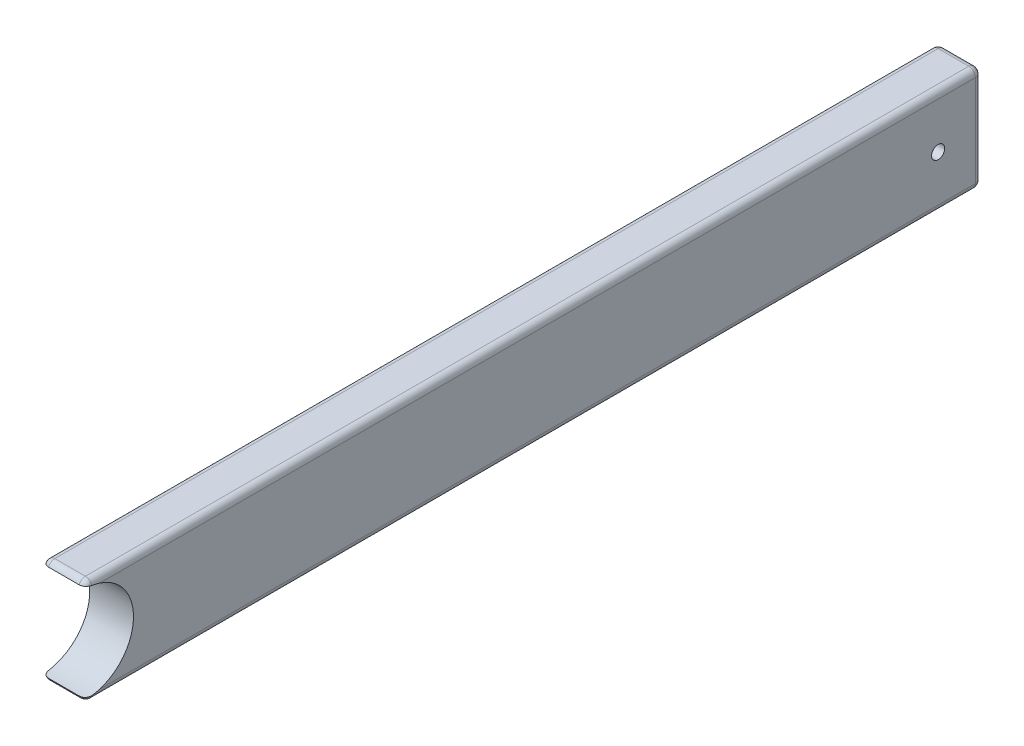
ISO-10303-21;
HEADER;
FILE_DESCRIPTION(('STEP AP214'),'2;1');
FILE_NAME('part.step','',(''),(''),'','','');
FILE_SCHEMA(('AUTOMOTIVE_DESIGN { 1 0 10303 214 1 1 1 1 }'));
ENDSEC;
DATA;
#1=APPLICATION_CONTEXT('core data for automotive mechanical design processes');
#2=APPLICATION_PROTOCOL_DEFINITION('international standard','automotive_design',2000,#1);
#3=PRODUCT_CONTEXT('',#1,'mechanical');
#4=PRODUCT('Part','Part','',(#3));
#5=PRODUCT_RELATED_PRODUCT_CATEGORY('part','',(#4));
#6=PRODUCT_DEFINITION_FORMATION('','',#4);
#7=PRODUCT_DEFINITION_CONTEXT('part definition',#1,'design');
#8=PRODUCT_DEFINITION('design','',#6,#7);
#9=PRODUCT_DEFINITION_SHAPE('','',#8);
#10=(LENGTH_UNIT() NAMED_UNIT(*) SI_UNIT(.MILLI.,.METRE.));
#11=(NAMED_UNIT(*) PLANE_ANGLE_UNIT() SI_UNIT($,.RADIAN.));
#12=(NAMED_UNIT(*) SI_UNIT($,.STERADIAN.) SOLID_ANGLE_UNIT());
#13=UNCERTAINTY_MEASURE_WITH_UNIT(LENGTH_MEASURE(1.E-05),#10,'distance_accuracy_value','');
#14=(GEOMETRIC_REPRESENTATION_CONTEXT(3) GLOBAL_UNCERTAINTY_ASSIGNED_CONTEXT((#13)) GLOBAL_UNIT_ASSIGNED_CONTEXT((#10,
#11,#12)) REPRESENTATION_CONTEXT('',''));
#15=CARTESIAN_POINT('',(0.,0.,0.));
#16=DIRECTION('',(0.,0.,1.));
#17=DIRECTION('',(1.,0.,0.));
#18=AXIS2_PLACEMENT_3D('',#15,#16,#17);
#19=CARTESIAN_POINT('',(65.,-10.5,-438.5));
#20=DIRECTION('',(1.,0.,0.));
#21=DIRECTION('',(0.,0.,-1.));
#22=AXIS2_PLACEMENT_3D('',#19,#20,#21);
#23=CYLINDRICAL_SURFACE('',#22,1.5);
#24=CARTESIAN_POINT('',(73.5,-10.5,-438.5));
#25=DIRECTION('',(1.,0.,0.));
#26=DIRECTION('',(0.,1.,0.));
#27=AXIS2_PLACEMENT_3D('',#24,#25,#26);
#28=CIRCLE('',#27,1.5);
#29=CARTESIAN_POINT('',(73.5,-12.,-438.5));
#30=VERTEX_POINT('',#29);
#31=CARTESIAN_POINT('',(73.5,-10.5,-440.));
#32=VERTEX_POINT('',#31);
#33=EDGE_CURVE('E358',#30,#32,#28,.T.);
#34=ORIENTED_EDGE('',*,*,#33,.F.);
#35=DIRECTION('',(1.,0.,0.));
#36=VECTOR('',#35,1.);
#37=CARTESIAN_POINT('',(65.,-12.,-438.5));
#38=LINE('',#37,#36);
#39=CARTESIAN_POINT('',(66.5,-12.,-438.5));
#40=VERTEX_POINT('',#39);
#41=EDGE_CURVE('E310',#30,#40,#38,.F.);
#42=ORIENTED_EDGE('',*,*,#41,.T.);
#43=CARTESIAN_POINT('',(66.5,-10.5,-438.5));
#44=DIRECTION('',(-1.,0.,0.));
#45=DIRECTION('',(0.,-1.,0.));
#46=AXIS2_PLACEMENT_3D('',#43,#44,#45);
#47=CIRCLE('',#46,1.5);
#48=CARTESIAN_POINT('',(66.5,-10.5,-440.));
#49=VERTEX_POINT('',#48);
#50=EDGE_CURVE('E294',#49,#40,#47,.T.);
#51=ORIENTED_EDGE('',*,*,#50,.F.);
#52=DIRECTION('',(1.,0.,0.));
#53=VECTOR('',#52,1.);
#54=CARTESIAN_POINT('',(65.,-10.5,-440.));
#55=LINE('',#54,#53);
#56=EDGE_CURVE('E306',#49,#32,#55,.T.);
#57=ORIENTED_EDGE('',*,*,#56,.T.);
#58=EDGE_LOOP('',(#34,#42,#51,#57));
#59=FACE_BOUND('',#58,.T.);
#60=ADVANCED_FACE('F33',(#59),#23,.T.);
#61=CARTESIAN_POINT('',(65.,10.5,-438.5));
#62=DIRECTION('',(1.,0.,0.));
#63=DIRECTION('',(0.,0.,-1.));
#64=AXIS2_PLACEMENT_3D('',#61,#62,#63);
#65=CYLINDRICAL_SURFACE('',#64,1.5);
#66=DIRECTION('',(1.,0.,0.));
#67=VECTOR('',#66,1.);
#68=CARTESIAN_POINT('',(65.,10.5,-440.));
#69=LINE('',#68,#67);
#70=CARTESIAN_POINT('',(73.5,10.5,-440.));
#71=VERTEX_POINT('',#70);
#72=CARTESIAN_POINT('',(66.5,10.5,-440.));
#73=VERTEX_POINT('',#72);
#74=EDGE_CURVE('E296',#71,#73,#69,.F.);
#75=ORIENTED_EDGE('',*,*,#74,.T.);
#76=CARTESIAN_POINT('',(66.5,10.5,-438.5));
#77=DIRECTION('',(-1.,0.,0.));
#78=DIRECTION('',(0.,-1.,0.));
#79=AXIS2_PLACEMENT_3D('',#76,#77,#78);
#80=CIRCLE('',#79,1.5);
#81=CARTESIAN_POINT('',(66.5,12.,-438.5));
#82=VERTEX_POINT('',#81);
#83=EDGE_CURVE('E271',#82,#73,#80,.T.);
#84=ORIENTED_EDGE('',*,*,#83,.F.);
#85=DIRECTION('',(1.,0.,0.));
#86=VECTOR('',#85,1.);
#87=CARTESIAN_POINT('',(65.,12.,-438.5));
#88=LINE('',#87,#86);
#89=CARTESIAN_POINT('',(73.5,12.,-438.5));
#90=VERTEX_POINT('',#89);
#91=EDGE_CURVE('E93',#90,#82,#88,.F.);
#92=ORIENTED_EDGE('',*,*,#91,.F.);
#93=CARTESIAN_POINT('',(73.5,10.5,-438.5));
#94=DIRECTION('',(1.,0.,0.));
#95=DIRECTION('',(0.,1.,0.));
#96=AXIS2_PLACEMENT_3D('',#93,#94,#95);
#97=CIRCLE('',#96,1.5);
#98=EDGE_CURVE('E325',#71,#90,#97,.T.);
#99=ORIENTED_EDGE('',*,*,#98,.F.);
#100=EDGE_LOOP('',(#75,#84,#92,#99));
#101=FACE_BOUND('',#100,.T.);
#102=ADVANCED_FACE('F379',(#101),#65,.T.);
#103=CARTESIAN_POINT('',(73.5,-12.,-438.5));
#104=DIRECTION('',(0.,1.,0.));
#105=DIRECTION('',(0.,0.,1.));
#106=AXIS2_PLACEMENT_3D('',#103,#104,#105);
#107=CYLINDRICAL_SURFACE('',#106,1.5);
#108=CARTESIAN_POINT('',(73.5,10.5,-438.5));
#109=DIRECTION('',(0.,1.,0.));
#110=DIRECTION('',(1.,0.,0.));
#111=AXIS2_PLACEMENT_3D('',#108,#109,#110);
#112=CIRCLE('',#111,1.5);
#113=CARTESIAN_POINT('',(75.,10.5,-438.5));
#114=VERTEX_POINT('',#113);
#115=EDGE_CURVE('E357',#114,#71,#112,.T.);
#116=ORIENTED_EDGE('',*,*,#115,.F.);
#117=DIRECTION('',(0.,1.,0.));
#118=VECTOR('',#117,1.);
#119=CARTESIAN_POINT('',(75.,-12.,-438.5));
#120=LINE('',#119,#118);
#121=CARTESIAN_POINT('',(75.,-10.5,-438.5));
#122=VERTEX_POINT('',#121);
#123=EDGE_CURVE('E385',#122,#114,#120,.T.);
#124=ORIENTED_EDGE('',*,*,#123,.F.);
#125=CARTESIAN_POINT('',(73.5,-10.5,-438.5));
#126=DIRECTION('',(0.,1.,0.));
#127=DIRECTION('',(1.,0.,0.));
#128=AXIS2_PLACEMENT_3D('',#125,#126,#127);
#129=CIRCLE('',#128,1.5);
#130=EDGE_CURVE('E355',#32,#122,#129,.F.);
#131=ORIENTED_EDGE('',*,*,#130,.F.);
#132=DIRECTION('',(0.,1.,0.));
#133=VECTOR('',#132,1.);
#134=CARTESIAN_POINT('',(73.5,-12.,-440.));
#135=LINE('',#134,#133);
#136=EDGE_CURVE('E309',#32,#71,#135,.T.);
#137=ORIENTED_EDGE('',*,*,#136,.T.);
#138=EDGE_LOOP('',(#116,#124,#131,#137));
#139=FACE_BOUND('',#138,.T.);
#140=ADVANCED_FACE('F348',(#139),#107,.T.);
#141=CARTESIAN_POINT('',(73.5,-10.5,-438.5));
#142=DIRECTION('',(1.,0.,0.));
#143=DIRECTION('',(0.,1.,0.));
#144=AXIS2_PLACEMENT_3D('',#141,#142,#143);
#145=SPHERICAL_SURFACE('',#144,1.5);
#146=ORIENTED_EDGE('',*,*,#33,.T.);
#147=ORIENTED_EDGE('',*,*,#130,.T.);
#148=CARTESIAN_POINT('',(73.5,-10.5,-438.5));
#149=DIRECTION('',(0.,0.,1.));
#150=DIRECTION('',(1.,0.,0.));
#151=AXIS2_PLACEMENT_3D('',#148,#149,#150);
#152=CIRCLE('',#151,1.5);
#153=EDGE_CURVE('E266',#30,#122,#152,.T.);
#154=ORIENTED_EDGE('',*,*,#153,.F.);
#155=EDGE_LOOP('',(#146,#147,#154));
#156=FACE_BOUND('',#155,.T.);
#157=ADVANCED_FACE('F343',(#156),#145,.T.);
#158=CARTESIAN_POINT('',(73.5,10.5,-438.5));
#159=DIRECTION('',(1.,0.,0.));
#160=DIRECTION('',(0.,1.,0.));
#161=AXIS2_PLACEMENT_3D('',#158,#159,#160);
#162=SPHERICAL_SURFACE('',#161,1.5);
#163=ORIENTED_EDGE('',*,*,#98,.T.);
#164=CARTESIAN_POINT('',(73.5,10.5,-438.5));
#165=DIRECTION('',(0.,0.,1.));
#166=DIRECTION('',(1.,0.,0.));
#167=AXIS2_PLACEMENT_3D('',#164,#165,#166);
#168=CIRCLE('',#167,1.5);
#169=EDGE_CURVE('E329',#114,#90,#168,.T.);
#170=ORIENTED_EDGE('',*,*,#169,.F.);
#171=ORIENTED_EDGE('',*,*,#115,.T.);
#172=EDGE_LOOP('',(#163,#170,#171));
#173=FACE_BOUND('',#172,.T.);
#174=ADVANCED_FACE('F339',(#173),#162,.T.);
#175=CARTESIAN_POINT('',(65.,-12.,-440.));
#176=DIRECTION('',(0.,1.,0.));
#177=DIRECTION('',(0.,0.,1.));
#178=AXIS2_PLACEMENT_3D('',#175,#176,#177);
#179=PLANE('',#178);
#180=DIRECTION('',(0.,0.,1.));
#181=VECTOR('',#180,1.);
#182=CARTESIAN_POINT('',(73.5,-12.,-440.));
#183=LINE('',#182,#181);
#184=CARTESIAN_POINT('',(73.5,-12.,-236.5));
#185=VERTEX_POINT('',#184);
#186=EDGE_CURVE('E387',#185,#30,#183,.F.);
#187=ORIENTED_EDGE('',*,*,#186,.F.);
#188=DIRECTION('',(1.,0.,0.));
#189=VECTOR('',#188,1.);
#190=CARTESIAN_POINT('',(65.,-12.,-236.5));
#191=LINE('',#190,#189);
#192=CARTESIAN_POINT('',(66.5,-12.,-236.5));
#193=VERTEX_POINT('',#192);
#194=EDGE_CURVE('E261',#193,#185,#191,.T.);
#195=ORIENTED_EDGE('',*,*,#194,.F.);
#196=DIRECTION('',(0.,0.,1.));
#197=VECTOR('',#196,1.);
#198=CARTESIAN_POINT('',(66.5,-12.,-440.));
#199=LINE('',#198,#197);
#200=EDGE_CURVE('E317',#40,#193,#199,.T.);
#201=ORIENTED_EDGE('',*,*,#200,.F.);
#202=ORIENTED_EDGE('',*,*,#41,.F.);
#203=EDGE_LOOP('',(#187,#195,#201,#202));
#204=FACE_BOUND('',#203,.T.);
#205=ADVANCED_FACE('F342',(#204),#179,.F.);
#206=CARTESIAN_POINT('',(65.,-12.,-440.));
#207=DIRECTION('',(0.,0.,1.));
#208=DIRECTION('',(1.,0.,0.));
#209=AXIS2_PLACEMENT_3D('',#206,#207,#208);
#210=PLANE('',#209);
#211=ORIENTED_EDGE('',*,*,#136,.F.);
#212=ORIENTED_EDGE('',*,*,#56,.F.);
#213=DIRECTION('',(0.,1.,0.));
#214=VECTOR('',#213,1.);
#215=CARTESIAN_POINT('',(66.5,-12.,-440.));
#216=LINE('',#215,#214);
#217=EDGE_CURVE('E299',#73,#49,#216,.F.);
#218=ORIENTED_EDGE('',*,*,#217,.F.);
#219=ORIENTED_EDGE('',*,*,#74,.F.);
#220=EDGE_LOOP('',(#211,#212,#218,#219));
#221=FACE_BOUND('',#220,.T.);
#222=ADVANCED_FACE('F286',(#221),#210,.F.);
#223=CARTESIAN_POINT('',(66.5,-10.5,-438.5));
#224=DIRECTION('',(-1.,0.,0.));
#225=DIRECTION('',(0.,-1.,0.));
#226=AXIS2_PLACEMENT_3D('',#223,#224,#225);
#227=SPHERICAL_SURFACE('',#226,1.5);
#228=ORIENTED_EDGE('',*,*,#50,.T.);
#229=CARTESIAN_POINT('',(66.5,-10.5,-438.5));
#230=DIRECTION('',(0.,0.,1.));
#231=DIRECTION('',(1.,0.,0.));
#232=AXIS2_PLACEMENT_3D('',#229,#230,#231);
#233=CIRCLE('',#232,1.5);
#234=CARTESIAN_POINT('',(65.,-10.5,-438.5));
#235=VERTEX_POINT('',#234);
#236=EDGE_CURVE('E144',#235,#40,#233,.T.);
#237=ORIENTED_EDGE('',*,*,#236,.F.);
#238=CARTESIAN_POINT('',(66.5,-10.5,-438.5));
#239=DIRECTION('',(0.,1.,0.));
#240=DIRECTION('',(0.,0.,1.));
#241=AXIS2_PLACEMENT_3D('',#238,#239,#240);
#242=CIRCLE('',#241,1.5);
#243=EDGE_CURVE('E302',#49,#235,#242,.T.);
#244=ORIENTED_EDGE('',*,*,#243,.F.);
#245=EDGE_LOOP('',(#228,#237,#244));
#246=FACE_BOUND('',#245,.T.);
#247=ADVANCED_FACE('F282',(#246),#227,.T.);
#248=CARTESIAN_POINT('',(65.,12.,-440.));
#249=DIRECTION('',(0.,1.,0.));
#250=DIRECTION('',(0.,0.,1.));
#251=AXIS2_PLACEMENT_3D('',#248,#249,#250);
#252=PLANE('',#251);
#253=DIRECTION('',(0.,0.,1.));
#254=VECTOR('',#253,1.);
#255=CARTESIAN_POINT('',(73.5,12.,-440.));
#256=LINE('',#255,#254);
#257=CARTESIAN_POINT('',(73.5,12.,-236.5));
#258=VERTEX_POINT('',#257);
#259=EDGE_CURVE('E140',#90,#258,#256,.T.);
#260=ORIENTED_EDGE('',*,*,#259,.F.);
#261=ORIENTED_EDGE('',*,*,#91,.T.);
#262=DIRECTION('',(0.,0.,1.));
#263=VECTOR('',#262,1.);
#264=CARTESIAN_POINT('',(66.5,12.,-440.));
#265=LINE('',#264,#263);
#266=CARTESIAN_POINT('',(66.5,12.,-236.5));
#267=VERTEX_POINT('',#266);
#268=EDGE_CURVE('E413',#267,#82,#265,.F.);
#269=ORIENTED_EDGE('',*,*,#268,.F.);
#270=DIRECTION('',(1.,0.,0.));
#271=VECTOR('',#270,1.);
#272=CARTESIAN_POINT('',(65.,12.,-236.5));
#273=LINE('',#272,#271);
#274=EDGE_CURVE('E199',#258,#267,#273,.F.);
#275=ORIENTED_EDGE('',*,*,#274,.F.);
#276=EDGE_LOOP('',(#260,#261,#269,#275));
#277=FACE_BOUND('',#276,.T.);
#278=ADVANCED_FACE('F278',(#277),#252,.T.);
#279=CARTESIAN_POINT('',(66.5,10.5,-438.5));
#280=DIRECTION('',(-1.,0.,0.));
#281=DIRECTION('',(0.,-1.,0.));
#282=AXIS2_PLACEMENT_3D('',#279,#280,#281);
#283=SPHERICAL_SURFACE('',#282,1.5);
#284=ORIENTED_EDGE('',*,*,#83,.T.);
#285=CARTESIAN_POINT('',(66.5,10.5,-438.5));
#286=DIRECTION('',(0.,1.,0.));
#287=DIRECTION('',(0.,0.,1.));
#288=AXIS2_PLACEMENT_3D('',#285,#286,#287);
#289=CIRCLE('',#288,1.5);
#290=CARTESIAN_POINT('',(65.,10.5,-438.5));
#291=VERTEX_POINT('',#290);
#292=EDGE_CURVE('E303',#291,#73,#289,.F.);
#293=ORIENTED_EDGE('',*,*,#292,.F.);
#294=CARTESIAN_POINT('',(66.5,10.5,-438.5));
#295=DIRECTION('',(0.,0.,1.));
#296=DIRECTION('',(1.,0.,0.));
#297=AXIS2_PLACEMENT_3D('',#294,#295,#296);
#298=CIRCLE('',#297,1.5);
#299=EDGE_CURVE('E412',#82,#291,#298,.T.);
#300=ORIENTED_EDGE('',*,*,#299,.F.);
#301=EDGE_LOOP('',(#284,#293,#300));
#302=FACE_BOUND('',#301,.T.);
#303=ADVANCED_FACE('F274',(#302),#283,.T.);
#304=CARTESIAN_POINT('',(75.,-12.,-440.));
#305=DIRECTION('',(1.,0.,0.));
#306=DIRECTION('',(0.,0.,-1.));
#307=AXIS2_PLACEMENT_3D('',#304,#305,#306);
#308=PLANE('',#307);
#309=CARTESIAN_POINT('',(75.,6.98746616123458E-12,-430.));
#310=DIRECTION('',(1.,0.,0.));
#311=DIRECTION('',(0.,0.,-1.));
#312=AXIS2_PLACEMENT_3D('',#309,#310,#311);
#313=CIRCLE('',#312,1.50000000000002);
#314=CARTESIAN_POINT('',(75.,6.98746616123458E-12,-431.5));
#315=VERTEX_POINT('',#314);
#316=EDGE_CURVE('E517',#315,#315,#313,.T.);
#317=ORIENTED_EDGE('',*,*,#316,.F.);
#318=EDGE_LOOP('',(#317));
#319=FACE_BOUND('',#318,.T.);
#320=DIRECTION('',(0.,0.,1.));
#321=VECTOR('',#320,1.);
#322=CARTESIAN_POINT('',(75.,10.5,-440.));
#323=LINE('',#322,#321);
#324=CARTESIAN_POINT('',(75.,10.5000000000073,-238.278719262128));
#325=VERTEX_POINT('',#324);
#326=EDGE_CURVE('E193',#325,#114,#323,.F.);
#327=ORIENTED_EDGE('',*,*,#326,.F.);
#328=CARTESIAN_POINT('',(75.,0.,-235.));
#329=DIRECTION('',(1.,0.,0.));
#330=DIRECTION('',(0.,0.,-1.));
#331=AXIS2_PLACEMENT_3D('',#328,#329,#330);
#332=CIRCLE('',#331,11.);
#333=CARTESIAN_POINT('',(75.,-10.5000000000073,-238.278719262128));
#334=VERTEX_POINT('',#333);
#335=EDGE_CURVE('E83',#325,#334,#332,.F.);
#336=ORIENTED_EDGE('',*,*,#335,.T.);
#337=DIRECTION('',(0.,0.,1.));
#338=VECTOR('',#337,1.);
#339=CARTESIAN_POINT('',(75.,-10.5,-440.));
#340=LINE('',#339,#338);
#341=EDGE_CURVE('E262',#122,#334,#340,.T.);
#342=ORIENTED_EDGE('',*,*,#341,.F.);
#343=ORIENTED_EDGE('',*,*,#123,.T.);
#344=EDGE_LOOP('',(#327,#336,#342,#343));
#345=FACE_BOUND('',#344,.T.);
#346=ADVANCED_FACE('F277',(#319,#345),#308,.T.);
#347=CARTESIAN_POINT('',(73.5,-10.5,-440.));
#348=DIRECTION('',(0.,0.,1.));
#349=DIRECTION('',(1.,0.,0.));
#350=AXIS2_PLACEMENT_3D('',#347,#348,#349);
#351=CYLINDRICAL_SURFACE('',#350,1.5);
#352=ORIENTED_EDGE('',*,*,#153,.T.);
#353=ORIENTED_EDGE('',*,*,#341,.T.);
#354=CARTESIAN_POINT('',(74.9999999999954,-10.5000000000102,-238.278719262103));
#355=CARTESIAN_POINT('',(74.9999639118355,-10.5453925146248,-238.133357506092));
#356=CARTESIAN_POINT('',(74.9979416530262,-10.5877543558598,-237.987079332439));
#357=CARTESIAN_POINT('',(74.9912827101491,-10.6662881967625,-237.693208977913));
#358=CARTESIAN_POINT('',(74.986650758317,-10.7024712462975,-237.545619650045));
#359=CARTESIAN_POINT('',(74.9761206035065,-10.768682505296,-237.249122947343));
#360=CARTESIAN_POINT('',(74.9702224385663,-10.7987108995981,-237.100215612233));
#361=CARTESIAN_POINT('',(74.9582177137497,-10.8526248059516,-236.80102294055));
#362=CARTESIAN_POINT('',(74.9521107967193,-10.876499125006,-236.650735600851));
#363=CARTESIAN_POINT('',(74.9464420264516,-10.8972473588517,-236.5));
#364=B_SPLINE_CURVE_WITH_KNOTS('',3,(#354,#355,#356,#357,#358,#359,#360,#361,#362,#363),
.UNSPECIFIED.,.F.,.F.,(4,2,2,2,4),(0.,0.456768232758397,0.912710847306426,1.3686397668289,
1.82539216764268),.UNSPECIFIED.);
#365=CARTESIAN_POINT('',(74.9464420264518,-10.8972473588508,-236.5));
#366=VERTEX_POINT('',#365);
#367=EDGE_CURVE('E240',#334,#366,#364,.T.);
#368=ORIENTED_EDGE('',*,*,#367,.T.);
#369=CARTESIAN_POINT('',(73.5,-10.5,-236.5));
#370=DIRECTION('',(0.,0.,-1.));
#371=DIRECTION('',(1.,0.,0.));
#372=AXIS2_PLACEMENT_3D('',#369,#370,#371);
#373=CIRCLE('',#372,1.5);
#374=EDGE_CURVE('E259',#185,#366,#373,.F.);
#375=ORIENTED_EDGE('',*,*,#374,.F.);
#376=ORIENTED_EDGE('',*,*,#186,.T.);
#377=EDGE_LOOP('',(#352,#353,#368,#375,#376));
#378=FACE_BOUND('',#377,.T.);
#379=ADVANCED_FACE('F250',(#378),#351,.T.);
#380=CARTESIAN_POINT('',(73.5,-10.5,-236.5));
#381=DIRECTION('',(1.,0.,0.));
#382=DIRECTION('',(0.,-1.,0.));
#383=AXIS2_PLACEMENT_3D('',#380,#381,#382);
#384=SPHERICAL_SURFACE('',#383,1.5);
#385=CARTESIAN_POINT('',(73.5,-10.5,-236.5));
#386=DIRECTION('',(1.,0.,0.));
#387=DIRECTION('',(0.,0.,-1.));
#388=AXIS2_PLACEMENT_3D('',#385,#386,#387);
#389=CIRCLE('',#388,1.5);
#390=CARTESIAN_POINT('',(73.5,-10.9996663995726,-235.085668536313));
#391=VERTEX_POINT('',#390);
#392=EDGE_CURVE('E397',#185,#391,#389,.F.);
#393=ORIENTED_EDGE('',*,*,#392,.F.);
#394=ORIENTED_EDGE('',*,*,#374,.T.);
#395=CARTESIAN_POINT('',(74.9464420264516,-10.8972473588517,-236.5));
#396=CARTESIAN_POINT('',(74.9445615453281,-10.9041078197752,-236.450187000559));
#397=CARTESIAN_POINT('',(74.9401472700026,-10.9106030899331,-236.40044272725));
#398=CARTESIAN_POINT('',(74.9262977190809,-10.9228488219817,-236.301478359127));
#399=CARTESIAN_POINT('',(74.916853985602,-10.9285980088927,-236.252259290176));
#400=CARTESIAN_POINT('',(74.8852171809121,-10.9428093764252,-236.123145381422));
#401=CARTESIAN_POINT('',(74.858725934488,-10.9505944726752,-236.044186848493));
#402=CARTESIAN_POINT('',(74.7928540567408,-10.9640730270342,-235.891620063521));
#403=CARTESIAN_POINT('',(74.7534646039752,-10.9697650479586,-235.818015515441));
#404=CARTESIAN_POINT('',(74.662887589608,-10.9792789599553,-235.678469412253));
#405=CARTESIAN_POINT('',(74.6117176095397,-10.9831036116488,-235.612516655861));
#406=CARTESIAN_POINT('',(74.4989266107611,-10.9892435100535,-235.490189995623));
#407=CARTESIAN_POINT('',(74.4373079764927,-10.9915591005584,-235.43381391219));
#408=CARTESIAN_POINT('',(74.3060814966746,-10.9950733611649,-235.332993203448));
#409=CARTESIAN_POINT('',(74.2365741052901,-10.9962846181248,-235.288418337154));
#410=CARTESIAN_POINT('',(74.0909692790757,-10.998028148663,-235.211787534411));
#411=CARTESIAN_POINT('',(74.014872929426,-10.9985605338231,-235.179729541247));
#412=CARTESIAN_POINT('',(73.8661966447833,-10.99923463265,-235.131740980274));
#413=CARTESIAN_POINT('',(73.7940376570146,-10.9994103696041,-235.11450869129));
#414=CARTESIAN_POINT('',(73.6844891950739,-10.9995716067455,-235.097229792324));
#415=CARTESIAN_POINT('',(73.6477330556637,-10.9996082826112,-235.092898393854));
#416=CARTESIAN_POINT('',(73.5739893562674,-10.9996552132516,-235.087117273113));
#417=CARTESIAN_POINT('',(73.5370017627227,-10.9996654641017,-235.085667978908));
#418=CARTESIAN_POINT('',(73.5,-10.9996663995725,-235.085668536326));
#419=B_SPLINE_CURVE_WITH_KNOTS('',3,(#395,#396,#397,#398,#399,#400,#401,#402,#403,#404,#405,
#406,#407,#408,#409,#410,#411,#412,#413,#414,#415,#416,#417,#418),.UNSPECIFIED.,.F.,.F.,(4,2,2,
2,2,2,2,2,2,2,2,4),(0.,0.150844778159072,0.301944032003489,0.551621682910461,0.801470453220885,
1.05094873326204,1.30037015738393,1.54691185861444,1.79341303217544,2.01502078455784,
2.12595315618591,2.23690200292141),.UNSPECIFIED.);
#420=EDGE_CURVE('E233',#366,#391,#419,.T.);
#421=ORIENTED_EDGE('',*,*,#420,.T.);
#422=EDGE_LOOP('',(#393,#394,#421));
#423=FACE_BOUND('',#422,.T.);
#424=ADVANCED_FACE('F246',(#423),#384,.T.);
#425=CARTESIAN_POINT('',(65.,-10.5,-236.5));
#426=DIRECTION('',(1.,0.,0.));
#427=DIRECTION('',(0.,0.,-1.));
#428=AXIS2_PLACEMENT_3D('',#425,#426,#427);
#429=CYLINDRICAL_SURFACE('',#428,1.5);
#430=DIRECTION('',(1.,0.,0.));
#431=VECTOR('',#430,1.);
#432=CARTESIAN_POINT('',(65.,-10.9996663995727,-235.0856685363));
#433=LINE('',#432,#431);
#434=CARTESIAN_POINT('',(66.5,-10.9996663995726,-235.085668536313));
#435=VERTEX_POINT('',#434);
#436=EDGE_CURVE('E228',#391,#435,#433,.F.);
#437=ORIENTED_EDGE('',*,*,#436,.T.);
#438=CARTESIAN_POINT('',(66.5,-10.5,-236.5));
#439=DIRECTION('',(-1.,0.,0.));
#440=DIRECTION('',(0.,1.,0.));
#441=AXIS2_PLACEMENT_3D('',#438,#439,#440);
#442=CIRCLE('',#441,1.5);
#443=EDGE_CURVE('E392',#193,#435,#442,.T.);
#444=ORIENTED_EDGE('',*,*,#443,.F.);
#445=ORIENTED_EDGE('',*,*,#194,.T.);
#446=ORIENTED_EDGE('',*,*,#392,.T.);
#447=EDGE_LOOP('',(#437,#444,#445,#446));
#448=FACE_BOUND('',#447,.T.);
#449=ADVANCED_FACE('F215',(#448),#429,.T.);
#450=CARTESIAN_POINT('',(66.5,-10.5,-236.5));
#451=DIRECTION('',(-1.,0.,0.));
#452=DIRECTION('',(0.,1.,0.));
#453=AXIS2_PLACEMENT_3D('',#450,#451,#452);
#454=SPHERICAL_SURFACE('',#453,1.5);
#455=ORIENTED_EDGE('',*,*,#443,.T.);
#456=CARTESIAN_POINT('',(66.5,-10.9996663995725,-235.085668536326));
#457=CARTESIAN_POINT('',(66.4598407221598,-10.9996651141746,-235.085668313333));
#458=CARTESIAN_POINT('',(66.4197009331714,-10.9996532474659,-235.087375411328));
#459=CARTESIAN_POINT('',(66.3397138232825,-10.9995975755772,-235.094182370936));
#460=CARTESIAN_POINT('',(66.2998664757094,-10.9995537733475,-235.099281919147));
#461=CARTESIAN_POINT('',(66.1813077492718,-10.9993585899589,-235.119606792177));
#462=CARTESIAN_POINT('',(66.1033992673383,-10.9991435216089,-235.139858570347));
#463=CARTESIAN_POINT('',(65.952104637231,-10.998336333894,-235.193127918412));
#464=CARTESIAN_POINT('',(65.8787197411943,-10.9977441106413,-235.226149004642));
#465=CARTESIAN_POINT('',(65.7384623907631,-10.9958691518745,-235.303922367128));
#466=CARTESIAN_POINT('',(65.6715897774238,-10.9945864332183,-235.34867435697));
#467=CARTESIAN_POINT('',(65.5456091651253,-10.9909486538239,-235.44897656277));
#468=CARTESIAN_POINT('',(65.4865720150062,-10.9885845687218,-235.504615350697));
#469=CARTESIAN_POINT('',(65.378457495951,-10.9824057605175,-235.624802175425));
#470=CARTESIAN_POINT('',(65.3293829989505,-10.9785906200276,-235.689352772251));
#471=CARTESIAN_POINT('',(65.2417236278633,-10.969115911536,-235.826621885693));
#472=CARTESIAN_POINT('',(65.203327521797,-10.9634266190585,-235.899458756925));
#473=CARTESIAN_POINT('',(65.1391182225437,-10.9500056849065,-236.050280887045));
#474=CARTESIAN_POINT('',(65.1132970995921,-10.9422753350754,-236.128262866113));
#475=CARTESIAN_POINT('',(65.0824553726205,-10.9282012744388,-236.255691300351));
#476=CARTESIAN_POINT('',(65.0732472493616,-10.9225166207049,-236.304237583295));
#477=CARTESIAN_POINT('',(65.0597297496576,-10.9104212118947,-236.401834394358));
#478=CARTESIAN_POINT('',(65.0554122300387,-10.9040116834168,-236.450883946647));
#479=CARTESIAN_POINT('',(65.0535579735484,-10.8972473588516,-236.5));
#480=B_SPLINE_CURVE_WITH_KNOTS('',3,(#456,#457,#458,#459,#460,#461,#462,#463,#464,#465,#466,
#467,#468,#469,#470,#471,#472,#473,#474,#475,#476,#477,#478,#479),.UNSPECIFIED.,.F.,.F.,(4,2,2,
2,2,2,2,2,2,2,2,4),(0.,0.120402982821563,0.240794844101106,0.481044274445955,0.721359910395158,
0.961669679505351,1.20402256951419,1.44644522373287,1.69291443603058,1.93922802333059,
2.08821374712578,2.23695103363693),.UNSPECIFIED.);
#481=CARTESIAN_POINT('',(65.0535579735482,-10.8972473588508,-236.5));
#482=VERTEX_POINT('',#481);
#483=EDGE_CURVE('E219',#435,#482,#480,.T.);
#484=ORIENTED_EDGE('',*,*,#483,.T.);
#485=CARTESIAN_POINT('',(66.5,-10.5,-236.5));
#486=DIRECTION('',(0.,0.,1.));
#487=DIRECTION('',(1.,0.,0.));
#488=AXIS2_PLACEMENT_3D('',#485,#486,#487);
#489=CIRCLE('',#488,1.5);
#490=EDGE_CURVE('E320',#193,#482,#489,.F.);
#491=ORIENTED_EDGE('',*,*,#490,.F.);
#492=EDGE_LOOP('',(#455,#484,#491));
#493=FACE_BOUND('',#492,.T.);
#494=ADVANCED_FACE('F210',(#493),#454,.T.);
#495=CARTESIAN_POINT('',(66.5,10.5,-236.5));
#496=DIRECTION('',(-1.,0.,0.));
#497=DIRECTION('',(0.,0.,-1.));
#498=AXIS2_PLACEMENT_3D('',#495,#496,#497);
#499=SPHERICAL_SURFACE('',#498,1.5);
#500=CARTESIAN_POINT('',(66.5,10.5,-236.5));
#501=DIRECTION('',(1.,0.,0.));
#502=DIRECTION('',(0.,0.,-1.));
#503=AXIS2_PLACEMENT_3D('',#500,#501,#502);
#504=CIRCLE('',#503,1.5);
#505=CARTESIAN_POINT('',(66.5,10.9996663995726,-235.085668536313));
#506=VERTEX_POINT('',#505);
#507=EDGE_CURVE('E194',#267,#506,#504,.T.);
#508=ORIENTED_EDGE('',*,*,#507,.F.);
#509=CARTESIAN_POINT('',(66.5,10.5,-236.5));
#510=DIRECTION('',(0.,0.,1.));
#511=DIRECTION('',(1.,0.,0.));
#512=AXIS2_PLACEMENT_3D('',#509,#510,#511);
#513=CIRCLE('',#512,1.5);
#514=CARTESIAN_POINT('',(65.0535579735485,10.8972473588518,-236.5));
#515=VERTEX_POINT('',#514);
#516=EDGE_CURVE('E419',#515,#267,#513,.F.);
#517=ORIENTED_EDGE('',*,*,#516,.F.);
#518=CARTESIAN_POINT('',(65.0535579735484,10.8972473588517,-236.5));
#519=CARTESIAN_POINT('',(65.0554384546719,10.9041078197752,-236.450187000559));
#520=CARTESIAN_POINT('',(65.0598527299974,10.9106030899331,-236.40044272725));
#521=CARTESIAN_POINT('',(65.0737022809191,10.9228488219817,-236.301478359127));
#522=CARTESIAN_POINT('',(65.083146014398,10.9285980088927,-236.252259290176));
#523=CARTESIAN_POINT('',(65.114782819088,10.9428093764253,-236.123145381422));
#524=CARTESIAN_POINT('',(65.141274065512,10.9505944726752,-236.044186848493));
#525=CARTESIAN_POINT('',(65.2071459432593,10.9640730270342,-235.89162006352));
#526=CARTESIAN_POINT('',(65.2465353960248,10.9697650479586,-235.818015515441));
#527=CARTESIAN_POINT('',(65.3371124103921,10.9792789599553,-235.678469412253));
#528=CARTESIAN_POINT('',(65.3882823904605,10.9831036116488,-235.612516655861));
#529=CARTESIAN_POINT('',(65.5010733892391,10.9892435100535,-235.490189995623));
#530=CARTESIAN_POINT('',(65.5626920235075,10.9915591005584,-235.43381391219));
#531=CARTESIAN_POINT('',(65.6939185033256,10.9950733611649,-235.332993203448));
#532=CARTESIAN_POINT('',(65.7634258947101,10.9962846181248,-235.288418337154));
#533=CARTESIAN_POINT('',(65.9090307209244,10.998028148663,-235.211787534411));
#534=CARTESIAN_POINT('',(65.9851270705742,10.9985605338231,-235.179729541247));
#535=CARTESIAN_POINT('',(66.1338033552168,10.99923463265,-235.131740980274));
#536=CARTESIAN_POINT('',(66.2059623429855,10.9994103696041,-235.11450869129));
#537=CARTESIAN_POINT('',(66.3155108049262,10.9995716067455,-235.097229792324));
#538=CARTESIAN_POINT('',(66.3522669443364,10.9996082826112,-235.092898393854));
#539=CARTESIAN_POINT('',(66.4260106437326,10.9996552132516,-235.087117273113));
#540=CARTESIAN_POINT('',(66.4629982372773,10.9996654641017,-235.085667978908));
#541=CARTESIAN_POINT('',(66.5,10.9996663995725,-235.085668536326));
#542=B_SPLINE_CURVE_WITH_KNOTS('',3,(#518,#519,#520,#521,#522,#523,#524,#525,#526,#527,#528,
#529,#530,#531,#532,#533,#534,#535,#536,#537,#538,#539,#540,#541),.UNSPECIFIED.,.F.,.F.,(4,2,2,
2,2,2,2,2,2,2,2,4),(0.,0.150844778159072,0.301944032003465,0.551621682910418,0.801470453220812,
1.05094873326196,1.30037015738387,1.54691185861437,1.79341303217536,2.01502078455767,
2.12595315618568,2.23690200292115),.UNSPECIFIED.);
#543=EDGE_CURVE('E157',#515,#506,#542,.T.);
#544=ORIENTED_EDGE('',*,*,#543,.T.);
#545=EDGE_LOOP('',(#508,#517,#544));
#546=FACE_BOUND('',#545,.T.);
#547=ADVANCED_FACE('F206',(#546),#499,.T.);
#548=CARTESIAN_POINT('',(65.,10.5,-236.5));
#549=DIRECTION('',(1.,0.,0.));
#550=DIRECTION('',(0.,0.,-1.));
#551=AXIS2_PLACEMENT_3D('',#548,#549,#550);
#552=CYLINDRICAL_SURFACE('',#551,1.5);
#553=DIRECTION('',(1.,0.,0.));
#554=VECTOR('',#553,1.);
#555=CARTESIAN_POINT('',(65.,10.9996663995727,-235.0856685363));
#556=LINE('',#555,#554);
#557=CARTESIAN_POINT('',(73.5,10.9996663995726,-235.085668536313));
#558=VERTEX_POINT('',#557);
#559=EDGE_CURVE('E155',#506,#558,#556,.T.);
#560=ORIENTED_EDGE('',*,*,#559,.T.);
#561=CARTESIAN_POINT('',(73.5,10.5,-236.5));
#562=DIRECTION('',(1.,0.,0.));
#563=DIRECTION('',(0.,0.,1.));
#564=AXIS2_PLACEMENT_3D('',#561,#562,#563);
#565=CIRCLE('',#564,1.5);
#566=EDGE_CURVE('E154',#258,#558,#565,.T.);
#567=ORIENTED_EDGE('',*,*,#566,.F.);
#568=ORIENTED_EDGE('',*,*,#274,.T.);
#569=ORIENTED_EDGE('',*,*,#507,.T.);
#570=EDGE_LOOP('',(#560,#567,#568,#569));
#571=FACE_BOUND('',#570,.T.);
#572=ADVANCED_FACE('F184',(#571),#552,.T.);
#573=CARTESIAN_POINT('',(73.5,10.5,-236.5));
#574=DIRECTION('',(1.,0.,0.));
#575=DIRECTION('',(0.,0.,1.));
#576=AXIS2_PLACEMENT_3D('',#573,#574,#575);
#577=SPHERICAL_SURFACE('',#576,1.5);
#578=ORIENTED_EDGE('',*,*,#566,.T.);
#579=CARTESIAN_POINT('',(73.5,10.9996663995725,-235.085668536326));
#580=CARTESIAN_POINT('',(73.5401592778402,10.9996651141746,-235.085668313333));
#581=CARTESIAN_POINT('',(73.5802990668286,10.9996532474659,-235.087375411328));
#582=CARTESIAN_POINT('',(73.6602861767175,10.9995975755772,-235.094182370936));
#583=CARTESIAN_POINT('',(73.7001335242906,10.9995537733475,-235.099281919147));
#584=CARTESIAN_POINT('',(73.8186922507282,10.9993585899589,-235.119606792177));
#585=CARTESIAN_POINT('',(73.8966007326617,10.9991435216089,-235.139858570347));
#586=CARTESIAN_POINT('',(74.047895362769,10.998336333894,-235.193127918412));
#587=CARTESIAN_POINT('',(74.1212802588057,10.9977441106413,-235.226149004642));
#588=CARTESIAN_POINT('',(74.2615376092369,10.9958691518745,-235.303922367128));
#589=CARTESIAN_POINT('',(74.3284102225762,10.9945864332183,-235.34867435697));
#590=CARTESIAN_POINT('',(74.4543908348747,10.9909486538239,-235.44897656277));
#591=CARTESIAN_POINT('',(74.5134279849938,10.9885845687218,-235.504615350697));
#592=CARTESIAN_POINT('',(74.621542504049,10.9824057605175,-235.624802175425));
#593=CARTESIAN_POINT('',(74.6706170010495,10.9785906200276,-235.689352772251));
#594=CARTESIAN_POINT('',(74.7582763721367,10.969115911536,-235.826621885693));
#595=CARTESIAN_POINT('',(74.796672478203,10.9634266190585,-235.899458756925));
#596=CARTESIAN_POINT('',(74.8608817774563,10.9500056849065,-236.050280887045));
#597=CARTESIAN_POINT('',(74.8867029004079,10.9422753350754,-236.128262866113));
#598=CARTESIAN_POINT('',(74.9175446273795,10.9282012744388,-236.255691300351));
#599=CARTESIAN_POINT('',(74.9267527506384,10.9225166207049,-236.304237583295));
#600=CARTESIAN_POINT('',(74.9402702503424,10.9104212118947,-236.401834394358));
#601=CARTESIAN_POINT('',(74.9445877699613,10.9040116834169,-236.450883946646));
#602=CARTESIAN_POINT('',(74.9464420264516,10.8972473588517,-236.5));
#603=B_SPLINE_CURVE_WITH_KNOTS('',3,(#579,#580,#581,#582,#583,#584,#585,#586,#587,#588,#589,
#590,#591,#592,#593,#594,#595,#596,#597,#598,#599,#600,#601,#602),.UNSPECIFIED.,.F.,.F.,(4,2,2,
2,2,2,2,2,2,2,2,4),(0.,0.120402982821565,0.24079484410109,0.481044274445952,0.721359910395168,
0.961669679505349,1.20402256951421,1.44644522373291,1.69291443603058,1.93922802333059,
2.08821374712565,2.23695103363668),.UNSPECIFIED.);
#604=CARTESIAN_POINT('',(74.9464420264515,10.8972473588518,-236.5));
#605=VERTEX_POINT('',#604);
#606=EDGE_CURVE('E149',#558,#605,#603,.T.);
#607=ORIENTED_EDGE('',*,*,#606,.T.);
#608=CARTESIAN_POINT('',(73.5,10.5,-236.5));
#609=DIRECTION('',(0.,0.,1.));
#610=DIRECTION('',(1.,0.,0.));
#611=AXIS2_PLACEMENT_3D('',#608,#609,#610);
#612=CIRCLE('',#611,1.5);
#613=EDGE_CURVE('E135',#258,#605,#612,.F.);
#614=ORIENTED_EDGE('',*,*,#613,.F.);
#615=EDGE_LOOP('',(#578,#607,#614));
#616=FACE_BOUND('',#615,.T.);
#617=ADVANCED_FACE('F153',(#616),#577,.T.);
#618=CARTESIAN_POINT('',(73.5,10.5,-440.));
#619=DIRECTION('',(0.,0.,1.));
#620=DIRECTION('',(1.,0.,0.));
#621=AXIS2_PLACEMENT_3D('',#618,#619,#620);
#622=CYLINDRICAL_SURFACE('',#621,1.5);
#623=ORIENTED_EDGE('',*,*,#613,.T.);
#624=CARTESIAN_POINT('',(74.9464420264516,10.8972473588517,-236.5));
#625=CARTESIAN_POINT('',(74.9521107967192,10.8764991250059,-236.650735600851));
#626=CARTESIAN_POINT('',(74.9582177137496,10.8526248059516,-236.801022940549));
#627=CARTESIAN_POINT('',(74.9702224385664,10.7987108995982,-237.100215612233));
#628=CARTESIAN_POINT('',(74.9761206035066,10.7686825052962,-237.249122947343));
#629=CARTESIAN_POINT('',(74.9866507583168,10.7024712462975,-237.545619650044));
#630=CARTESIAN_POINT('',(74.9912827101486,10.6662881967621,-237.693208977912));
#631=CARTESIAN_POINT('',(74.9979416530266,10.5877543558604,-237.987079332439));
#632=CARTESIAN_POINT('',(74.9999639118372,10.5453925146266,-238.133357506092));
#633=CARTESIAN_POINT('',(75.,10.5000000000148,-238.278719262104));
#634=B_SPLINE_CURVE_WITH_KNOTS('',3,(#624,#625,#626,#627,#628,#629,#630,#631,#632,#633),
.UNSPECIFIED.,.F.,.F.,(4,2,2,2,4),(0.,0.456752400813698,0.912681320336166,1.36862393488408,
1.82539216764215),.UNSPECIFIED.);
#635=EDGE_CURVE('E138',#605,#325,#634,.T.);
#636=ORIENTED_EDGE('',*,*,#635,.T.);
#637=ORIENTED_EDGE('',*,*,#326,.T.);
#638=ORIENTED_EDGE('',*,*,#169,.T.);
#639=ORIENTED_EDGE('',*,*,#259,.T.);
#640=EDGE_LOOP('',(#623,#636,#637,#638,#639));
#641=FACE_BOUND('',#640,.T.);
#642=ADVANCED_FACE('F136',(#641),#622,.T.);
#643=CARTESIAN_POINT('',(66.5,-10.5,-440.));
#644=DIRECTION('',(0.,0.,1.));
#645=DIRECTION('',(1.,0.,0.));
#646=AXIS2_PLACEMENT_3D('',#643,#644,#645);
#647=CYLINDRICAL_SURFACE('',#646,1.5);
#648=ORIENTED_EDGE('',*,*,#490,.T.);
#649=CARTESIAN_POINT('',(65.0535579735484,-10.8972473588517,-236.5));
#650=CARTESIAN_POINT('',(65.0478892032808,-10.8764991250059,-236.650735600851));
#651=CARTESIAN_POINT('',(65.0417822862504,-10.8526248059516,-236.801022940549));
#652=CARTESIAN_POINT('',(65.0297775614336,-10.7987108995982,-237.100215612233));
#653=CARTESIAN_POINT('',(65.0238793964934,-10.7686825052962,-237.249122947343));
#654=CARTESIAN_POINT('',(65.0133492416832,-10.7024712462975,-237.545619650044));
#655=CARTESIAN_POINT('',(65.0087172898514,-10.6662881967621,-237.693208977912));
#656=CARTESIAN_POINT('',(65.0020583469734,-10.5877543558604,-237.987079332439));
#657=CARTESIAN_POINT('',(65.0000360881629,-10.5453925146266,-238.133357506092));
#658=CARTESIAN_POINT('',(65.,-10.5000000000148,-238.278719262104));
#659=B_SPLINE_CURVE_WITH_KNOTS('',3,(#649,#650,#651,#652,#653,#654,#655,#656,#657,#658),
.UNSPECIFIED.,.F.,.F.,(4,2,2,2,4),(0.,0.456752400813643,0.912681320336055,1.36862393488385,
1.82539216764193),.UNSPECIFIED.);
#660=CARTESIAN_POINT('',(65.,-10.5000000000074,-238.278719262127));
#661=VERTEX_POINT('',#660);
#662=EDGE_CURVE('E227',#482,#661,#659,.T.);
#663=ORIENTED_EDGE('',*,*,#662,.T.);
#664=DIRECTION('',(0.,0.,-1.));
#665=VECTOR('',#664,1.);
#666=CARTESIAN_POINT('',(65.,-10.5,-440.));
#667=LINE('',#666,#665);
#668=EDGE_CURVE('E151',#661,#235,#667,.T.);
#669=ORIENTED_EDGE('',*,*,#668,.T.);
#670=ORIENTED_EDGE('',*,*,#236,.T.);
#671=ORIENTED_EDGE('',*,*,#200,.T.);
#672=EDGE_LOOP('',(#648,#663,#669,#670,#671));
#673=FACE_BOUND('',#672,.T.);
#674=ADVANCED_FACE('F451',(#673),#647,.T.);
#675=CARTESIAN_POINT('',(66.5,-12.,-438.5));
#676=DIRECTION('',(0.,1.,0.));
#677=DIRECTION('',(0.,0.,1.));
#678=AXIS2_PLACEMENT_3D('',#675,#676,#677);
#679=CYLINDRICAL_SURFACE('',#678,1.5);
#680=ORIENTED_EDGE('',*,*,#217,.T.);
#681=ORIENTED_EDGE('',*,*,#243,.T.);
#682=DIRECTION('',(0.,1.,0.));
#683=VECTOR('',#682,1.);
#684=CARTESIAN_POINT('',(65.,-12.,-438.5));
#685=LINE('',#684,#683);
#686=EDGE_CURVE('E427',#235,#291,#685,.T.);
#687=ORIENTED_EDGE('',*,*,#686,.T.);
#688=ORIENTED_EDGE('',*,*,#292,.T.);
#689=EDGE_LOOP('',(#680,#681,#687,#688));
#690=FACE_BOUND('',#689,.T.);
#691=ADVANCED_FACE('F487',(#690),#679,.T.);
#692=CARTESIAN_POINT('',(66.5,10.5,-440.));
#693=DIRECTION('',(0.,0.,1.));
#694=DIRECTION('',(1.,0.,0.));
#695=AXIS2_PLACEMENT_3D('',#692,#693,#694);
#696=CYLINDRICAL_SURFACE('',#695,1.5);
#697=ORIENTED_EDGE('',*,*,#299,.T.);
#698=DIRECTION('',(0.,0.,-1.));
#699=VECTOR('',#698,1.);
#700=CARTESIAN_POINT('',(65.,10.5,-440.));
#701=LINE('',#700,#699);
#702=CARTESIAN_POINT('',(65.,10.5000000000073,-238.278719262128));
#703=VERTEX_POINT('',#702);
#704=EDGE_CURVE('E42',#291,#703,#701,.F.);
#705=ORIENTED_EDGE('',*,*,#704,.T.);
#706=CARTESIAN_POINT('',(65.0000000000046,10.5000000000102,-238.278719262103));
#707=CARTESIAN_POINT('',(65.0000360881645,10.5453925146248,-238.133357506092));
#708=CARTESIAN_POINT('',(65.0020583469738,10.5877543558598,-237.987079332439));
#709=CARTESIAN_POINT('',(65.0087172898509,10.6662881967625,-237.693208977913));
#710=CARTESIAN_POINT('',(65.013349241683,10.7024712462975,-237.545619650045));
#711=CARTESIAN_POINT('',(65.0238793964935,10.768682505296,-237.249122947343));
#712=CARTESIAN_POINT('',(65.0297775614337,10.7987108995981,-237.100215612233));
#713=CARTESIAN_POINT('',(65.0417822862503,10.8526248059516,-236.801022940549));
#714=CARTESIAN_POINT('',(65.0478892032807,10.876499125006,-236.650735600851));
#715=CARTESIAN_POINT('',(65.0535579735484,10.8972473588517,-236.5));
#716=B_SPLINE_CURVE_WITH_KNOTS('',3,(#706,#707,#708,#709,#710,#711,#712,#713,#714,#715),
.UNSPECIFIED.,.F.,.F.,(4,2,2,2,4),(0.,0.456768232758426,0.91271084730654,1.36863976682907,
1.8253921676429),.UNSPECIFIED.);
#717=EDGE_CURVE('E50',#703,#515,#716,.T.);
#718=ORIENTED_EDGE('',*,*,#717,.T.);
#719=ORIENTED_EDGE('',*,*,#516,.T.);
#720=ORIENTED_EDGE('',*,*,#268,.T.);
#721=EDGE_LOOP('',(#697,#705,#718,#719,#720));
#722=FACE_BOUND('',#721,.T.);
#723=ADVANCED_FACE('F475',(#722),#696,.T.);
#724=CARTESIAN_POINT('',(65.,0.,-235.));
#725=DIRECTION('',(1.,0.,0.));
#726=DIRECTION('',(0.,0.,-1.));
#727=AXIS2_PLACEMENT_3D('',#724,#725,#726);
#728=CYLINDRICAL_SURFACE('',#727,11.);
#729=ORIENTED_EDGE('',*,*,#606,.F.);
#730=ORIENTED_EDGE('',*,*,#559,.F.);
#731=ORIENTED_EDGE('',*,*,#543,.F.);
#732=ORIENTED_EDGE('',*,*,#717,.F.);
#733=CARTESIAN_POINT('',(65.,0.,-235.));
#734=DIRECTION('',(1.,0.,0.));
#735=DIRECTION('',(0.,0.,-1.));
#736=AXIS2_PLACEMENT_3D('',#733,#734,#735);
#737=CIRCLE('',#736,11.);
#738=EDGE_CURVE('E11',#703,#661,#737,.F.);
#739=ORIENTED_EDGE('',*,*,#738,.T.);
#740=ORIENTED_EDGE('',*,*,#662,.F.);
#741=ORIENTED_EDGE('',*,*,#483,.F.);
#742=ORIENTED_EDGE('',*,*,#436,.F.);
#743=ORIENTED_EDGE('',*,*,#420,.F.);
#744=ORIENTED_EDGE('',*,*,#367,.F.);
#745=ORIENTED_EDGE('',*,*,#335,.F.);
#746=ORIENTED_EDGE('',*,*,#635,.F.);
#747=EDGE_LOOP('',(#729,#730,#731,#732,#739,#740,#741,#742,#743,#744,#745,#746));
#748=FACE_BOUND('',#747,.T.);
#749=ADVANCED_FACE('F147',(#748),#728,.F.);
#750=CARTESIAN_POINT('',(65.,-12.,-440.));
#751=DIRECTION('',(1.,0.,0.));
#752=DIRECTION('',(0.,0.,-1.));
#753=AXIS2_PLACEMENT_3D('',#750,#751,#752);
#754=PLANE('',#753);
#755=CARTESIAN_POINT('',(65.,6.98746616123458E-12,-430.));
#756=DIRECTION('',(1.,0.,0.));
#757=DIRECTION('',(0.,0.,-1.));
#758=AXIS2_PLACEMENT_3D('',#755,#756,#757);
#759=CIRCLE('',#758,1.50000000000002);
#760=CARTESIAN_POINT('',(65.,6.98746616123458E-12,-431.5));
#761=VERTEX_POINT('',#760);
#762=EDGE_CURVE('E36',#761,#761,#759,.T.);
#763=ORIENTED_EDGE('',*,*,#762,.T.);
#764=EDGE_LOOP('',(#763));
#765=FACE_BOUND('',#764,.T.);
#766=ORIENTED_EDGE('',*,*,#704,.F.);
#767=ORIENTED_EDGE('',*,*,#686,.F.);
#768=ORIENTED_EDGE('',*,*,#668,.F.);
#769=ORIENTED_EDGE('',*,*,#738,.F.);
#770=EDGE_LOOP('',(#766,#767,#768,#769));
#771=FACE_BOUND('',#770,.T.);
#772=ADVANCED_FACE('F495',(#765,#771),#754,.F.);
#773=CARTESIAN_POINT('',(53.,6.98746616123458E-12,-430.));
#774=DIRECTION('',(1.,0.,0.));
#775=DIRECTION('',(0.,0.,-1.));
#776=AXIS2_PLACEMENT_3D('',#773,#774,#775);
#777=CYLINDRICAL_SURFACE('',#776,1.50000000000002);
#778=ORIENTED_EDGE('',*,*,#316,.T.);
#779=EDGE_LOOP('',(#778));
#780=FACE_BOUND('',#779,.T.);
#781=ORIENTED_EDGE('',*,*,#762,.F.);
#782=EDGE_LOOP('',(#781));
#783=FACE_BOUND('',#782,.T.);
#784=ADVANCED_FACE('F497',(#780,#783),#777,.F.);
#785=CLOSED_SHELL('',(#60,#102,#140,#157,#174,#205,#222,#247,#278,#303,#346,#379,#424,#449,#494,
#547,#572,#617,#642,#674,#691,#723,#749,#772,#784));
#786=MANIFOLD_SOLID_BREP('B2',#785);
#787=ADVANCED_BREP_SHAPE_REPRESENTATION('',(#18,#786),#14);
#788=SHAPE_DEFINITION_REPRESENTATION(#9,#787);
ENDSEC;
END-ISO-10303-21;
